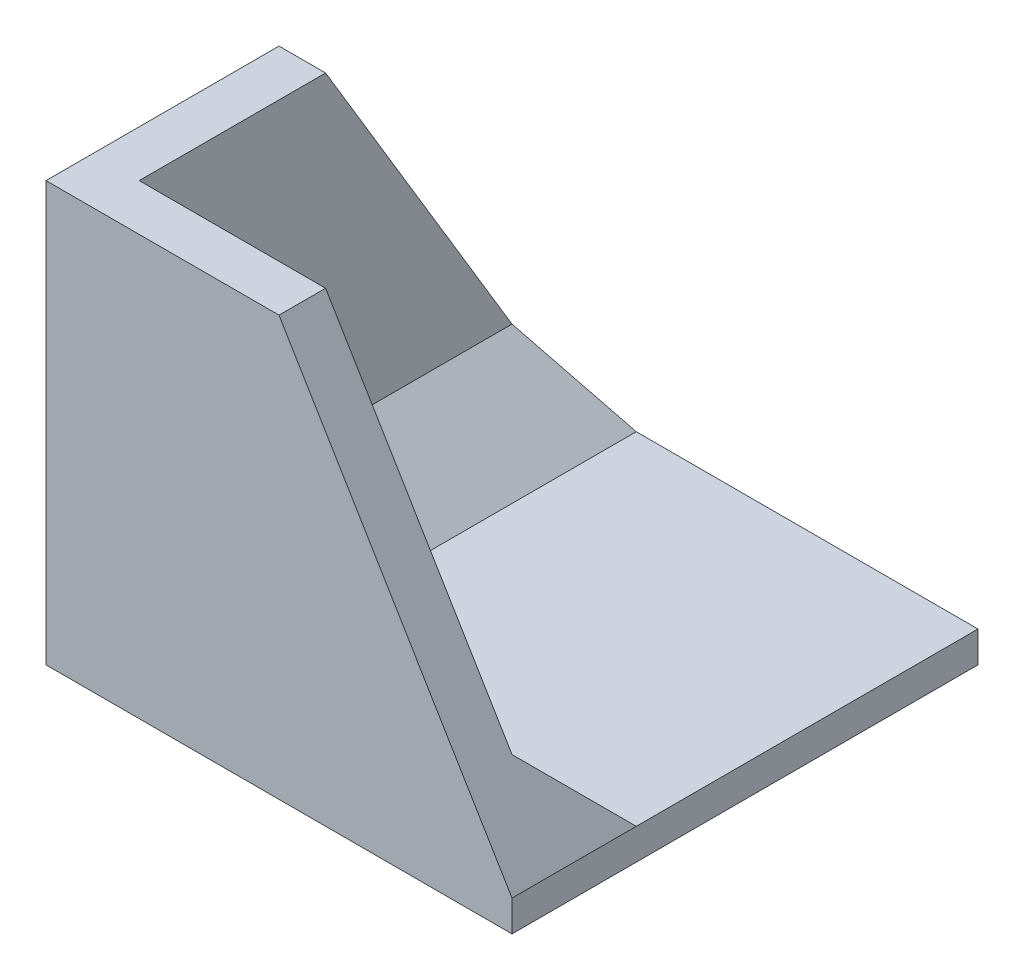
ISO-10303-21;
HEADER;
FILE_DESCRIPTION(('STEP AP214'),'2;1');
FILE_NAME('part.step','',(''),(''),'','','');
FILE_SCHEMA(('AUTOMOTIVE_DESIGN { 1 0 10303 214 1 1 1 1 }'));
ENDSEC;
DATA;
#1=APPLICATION_CONTEXT('core data for automotive mechanical design processes');
#2=APPLICATION_PROTOCOL_DEFINITION('international standard','automotive_design',2000,#1);
#3=PRODUCT_CONTEXT('',#1,'mechanical');
#4=PRODUCT('Part','Part','',(#3));
#5=PRODUCT_RELATED_PRODUCT_CATEGORY('part','',(#4));
#6=PRODUCT_DEFINITION_FORMATION('','',#4);
#7=PRODUCT_DEFINITION_CONTEXT('part definition',#1,'design');
#8=PRODUCT_DEFINITION('design','',#6,#7);
#9=PRODUCT_DEFINITION_SHAPE('','',#8);
#10=(LENGTH_UNIT() NAMED_UNIT(*) SI_UNIT(.MILLI.,.METRE.));
#11=(NAMED_UNIT(*) PLANE_ANGLE_UNIT() SI_UNIT($,.RADIAN.));
#12=(NAMED_UNIT(*) SI_UNIT($,.STERADIAN.) SOLID_ANGLE_UNIT());
#13=UNCERTAINTY_MEASURE_WITH_UNIT(LENGTH_MEASURE(1.E-05),#10,'distance_accuracy_value','');
#14=(GEOMETRIC_REPRESENTATION_CONTEXT(3) GLOBAL_UNCERTAINTY_ASSIGNED_CONTEXT((#13)) GLOBAL_UNIT_ASSIGNED_CONTEXT((#10,
#11,#12)) REPRESENTATION_CONTEXT('',''));
#15=CARTESIAN_POINT('',(0.,0.,0.));
#16=DIRECTION('',(0.,0.,1.));
#17=DIRECTION('',(1.,0.,0.));
#18=AXIS2_PLACEMENT_3D('',#15,#16,#17);
#19=CARTESIAN_POINT('',(0.,2.54,0.));
#20=DIRECTION('',(0.,-1.,0.));
#21=DIRECTION('',(0.,0.,-1.));
#22=AXIS2_PLACEMENT_3D('',#19,#20,#21);
#23=PLANE('',#22);
#24=DIRECTION('',(-1.,0.,0.));
#25=VECTOR('',#24,1.);
#26=CARTESIAN_POINT('',(-19.05,2.54,-19.05));
#27=LINE('',#26,#25);
#28=CARTESIAN_POINT('',(19.05,2.54,-19.05));
#29=VERTEX_POINT('',#28);
#30=CARTESIAN_POINT('',(-8.88999999999995,2.54,-19.05));
#31=VERTEX_POINT('',#30);
#32=EDGE_CURVE('E169',#29,#31,#27,.T.);
#33=ORIENTED_EDGE('',*,*,#32,.T.);
#34=DIRECTION('',(0.,0.,1.));
#35=VECTOR('',#34,1.);
#36=CARTESIAN_POINT('',(-8.88999999999995,2.54,15.24));
#37=LINE('',#36,#35);
#38=CARTESIAN_POINT('',(-8.88999999999995,2.54,8.88999999999995));
#39=VERTEX_POINT('',#38);
#40=EDGE_CURVE('E205',#31,#39,#37,.T.);
#41=ORIENTED_EDGE('',*,*,#40,.T.);
#42=DIRECTION('',(1.,0.,0.));
#43=VECTOR('',#42,1.);
#44=CARTESIAN_POINT('',(19.05,2.54,8.88999999999995));
#45=LINE('',#44,#43);
#46=CARTESIAN_POINT('',(19.05,2.54,8.88999999999995));
#47=VERTEX_POINT('',#46);
#48=EDGE_CURVE('E201',#39,#47,#45,.T.);
#49=ORIENTED_EDGE('',*,*,#48,.T.);
#50=DIRECTION('',(0.,0.,-1.));
#51=VECTOR('',#50,1.);
#52=CARTESIAN_POINT('',(19.05,2.54,19.05));
#53=LINE('',#52,#51);
#54=EDGE_CURVE('E170',#47,#29,#53,.T.);
#55=ORIENTED_EDGE('',*,*,#54,.T.);
#56=EDGE_LOOP('',(#33,#41,#49,#55));
#57=FACE_BOUND('',#56,.T.);
#58=ADVANCED_FACE('F39',(#57),#23,.F.);
#59=CARTESIAN_POINT('',(19.05,2.54,19.05));
#60=DIRECTION('',(-1.,0.,0.));
#61=DIRECTION('',(0.,0.,1.));
#62=AXIS2_PLACEMENT_3D('',#59,#60,#61);
#63=PLANE('',#62);
#64=DIRECTION('',(0.,0.,-1.));
#65=VECTOR('',#64,1.);
#66=CARTESIAN_POINT('',(19.05,0.,19.05));
#67=LINE('',#66,#65);
#68=CARTESIAN_POINT('',(19.05,0.,19.05));
#69=VERTEX_POINT('',#68);
#70=CARTESIAN_POINT('',(19.05,0.,-19.05));
#71=VERTEX_POINT('',#70);
#72=EDGE_CURVE('E164',#69,#71,#67,.T.);
#73=ORIENTED_EDGE('',*,*,#72,.T.);
#74=DIRECTION('',(0.,-1.,0.));
#75=VECTOR('',#74,1.);
#76=CARTESIAN_POINT('',(19.05,2.54,-19.05));
#77=LINE('',#76,#75);
#78=EDGE_CURVE('E197',#29,#71,#77,.T.);
#79=ORIENTED_EDGE('',*,*,#78,.F.);
#80=ORIENTED_EDGE('',*,*,#54,.F.);
#81=CARTESIAN_POINT('',(19.05,2.54,19.05));
#82=VERTEX_POINT('',#81);
#83=EDGE_CURVE('E165',#82,#47,#53,.T.);
#84=ORIENTED_EDGE('',*,*,#83,.F.);
#85=DIRECTION('',(0.,-1.,0.));
#86=VECTOR('',#85,1.);
#87=CARTESIAN_POINT('',(19.05,2.54,19.05));
#88=LINE('',#87,#86);
#89=EDGE_CURVE('E173',#82,#69,#88,.T.);
#90=ORIENTED_EDGE('',*,*,#89,.T.);
#91=EDGE_LOOP('',(#73,#79,#80,#84,#90));
#92=FACE_BOUND('',#91,.T.);
#93=ADVANCED_FACE('F225',(#92),#63,.F.);
#94=CARTESIAN_POINT('',(-19.05,2.54,-19.05));
#95=DIRECTION('',(0.,0.,1.));
#96=DIRECTION('',(1.,0.,0.));
#97=AXIS2_PLACEMENT_3D('',#94,#95,#96);
#98=PLANE('',#97);
#99=DIRECTION('',(-1.,0.,0.));
#100=VECTOR('',#99,1.);
#101=CARTESIAN_POINT('',(-19.05,0.,-19.05));
#102=LINE('',#101,#100);
#103=CARTESIAN_POINT('',(-19.05,0.,-19.05));
#104=VERTEX_POINT('',#103);
#105=EDGE_CURVE('E177',#71,#104,#102,.T.);
#106=ORIENTED_EDGE('',*,*,#105,.T.);
#107=DIRECTION('',(0.,-1.,0.));
#108=VECTOR('',#107,1.);
#109=CARTESIAN_POINT('',(-19.05,2.54,-19.05));
#110=LINE('',#109,#108);
#111=CARTESIAN_POINT('',(-19.05,2.54,-19.05));
#112=VERTEX_POINT('',#111);
#113=EDGE_CURVE('E193',#112,#104,#110,.T.);
#114=ORIENTED_EDGE('',*,*,#113,.F.);
#115=DIRECTION('',(-1.,0.,0.));
#116=VECTOR('',#115,1.);
#117=CARTESIAN_POINT('',(-15.24,2.54,-19.05));
#118=LINE('',#117,#116);
#119=EDGE_CURVE('E57',#31,#112,#118,.T.);
#120=ORIENTED_EDGE('',*,*,#119,.F.);
#121=ORIENTED_EDGE('',*,*,#32,.F.);
#122=ORIENTED_EDGE('',*,*,#78,.T.);
#123=EDGE_LOOP('',(#106,#114,#120,#121,#122));
#124=FACE_BOUND('',#123,.T.);
#125=ADVANCED_FACE('F223',(#124),#98,.F.);
#126=CARTESIAN_POINT('',(-19.05,2.54,19.05));
#127=DIRECTION('',(1.,0.,0.));
#128=DIRECTION('',(0.,0.,-1.));
#129=AXIS2_PLACEMENT_3D('',#126,#127,#128);
#130=PLANE('',#129);
#131=DIRECTION('',(0.,0.,1.));
#132=VECTOR('',#131,1.);
#133=CARTESIAN_POINT('',(-19.05,0.,19.05));
#134=LINE('',#133,#132);
#135=CARTESIAN_POINT('',(-19.05,0.,19.05));
#136=VERTEX_POINT('',#135);
#137=EDGE_CURVE('E180',#104,#136,#134,.T.);
#138=ORIENTED_EDGE('',*,*,#137,.T.);
#139=DIRECTION('',(0.,-1.,0.));
#140=VECTOR('',#139,1.);
#141=CARTESIAN_POINT('',(-19.05,2.54,19.05));
#142=LINE('',#141,#140);
#143=CARTESIAN_POINT('',(-19.05,34.29,19.05));
#144=VERTEX_POINT('',#143);
#145=EDGE_CURVE('E189',#144,#136,#142,.T.);
#146=ORIENTED_EDGE('',*,*,#145,.F.);
#147=DIRECTION('',(0.,0.,1.));
#148=VECTOR('',#147,1.);
#149=CARTESIAN_POINT('',(-19.05,34.29,0.));
#150=LINE('',#149,#148);
#151=CARTESIAN_POINT('',(-19.05,34.29,0.));
#152=VERTEX_POINT('',#151);
#153=EDGE_CURVE('E157',#152,#144,#150,.T.);
#154=ORIENTED_EDGE('',*,*,#153,.F.);
#155=DIRECTION('',(0.,-0.857492925712544,-0.514495755427527));
#156=VECTOR('',#155,1.);
#157=CARTESIAN_POINT('',(-19.05,2.54,-19.05));
#158=LINE('',#157,#156);
#159=EDGE_CURVE('E132',#152,#112,#158,.T.);
#160=ORIENTED_EDGE('',*,*,#159,.T.);
#161=ORIENTED_EDGE('',*,*,#113,.T.);
#162=EDGE_LOOP('',(#138,#146,#154,#160,#161));
#163=FACE_BOUND('',#162,.T.);
#164=ADVANCED_FACE('F235',(#163),#130,.F.);
#165=CARTESIAN_POINT('',(-19.05,2.54,19.05));
#166=DIRECTION('',(0.,0.,-1.));
#167=DIRECTION('',(-1.,0.,0.));
#168=AXIS2_PLACEMENT_3D('',#165,#166,#167);
#169=PLANE('',#168);
#170=ORIENTED_EDGE('',*,*,#89,.F.);
#171=DIRECTION('',(-0.514495755427526,0.857492925712544,0.));
#172=VECTOR('',#171,1.);
#173=CARTESIAN_POINT('',(0.,34.29,19.05));
#174=LINE('',#173,#172);
#175=CARTESIAN_POINT('',(0.,34.29,19.05));
#176=VERTEX_POINT('',#175);
#177=EDGE_CURVE('E134',#82,#176,#174,.T.);
#178=ORIENTED_EDGE('',*,*,#177,.T.);
#179=DIRECTION('',(1.,0.,0.));
#180=VECTOR('',#179,1.);
#181=CARTESIAN_POINT('',(0.,34.29,19.05));
#182=LINE('',#181,#180);
#183=EDGE_CURVE('E160',#144,#176,#182,.T.);
#184=ORIENTED_EDGE('',*,*,#183,.F.);
#185=ORIENTED_EDGE('',*,*,#145,.T.);
#186=DIRECTION('',(1.,0.,0.));
#187=VECTOR('',#186,1.);
#188=CARTESIAN_POINT('',(-19.05,0.,19.05));
#189=LINE('',#188,#187);
#190=EDGE_CURVE('E183',#136,#69,#189,.T.);
#191=ORIENTED_EDGE('',*,*,#190,.T.);
#192=EDGE_LOOP('',(#170,#178,#184,#185,#191));
#193=FACE_BOUND('',#192,.T.);
#194=ADVANCED_FACE('F238',(#193),#169,.F.);
#195=CARTESIAN_POINT('',(0.,0.,0.));
#196=DIRECTION('',(0.,-1.,0.));
#197=DIRECTION('',(0.,0.,-1.));
#198=AXIS2_PLACEMENT_3D('',#195,#196,#197);
#199=PLANE('',#198);
#200=ORIENTED_EDGE('',*,*,#72,.F.);
#201=ORIENTED_EDGE('',*,*,#190,.F.);
#202=ORIENTED_EDGE('',*,*,#137,.F.);
#203=ORIENTED_EDGE('',*,*,#105,.F.);
#204=EDGE_LOOP('',(#200,#201,#202,#203));
#205=FACE_BOUND('',#204,.T.);
#206=ADVANCED_FACE('F232',(#205),#199,.T.);
#207=CARTESIAN_POINT('',(0.,34.29,0.));
#208=DIRECTION('',(0.,-1.,0.));
#209=DIRECTION('',(0.,0.,-1.));
#210=AXIS2_PLACEMENT_3D('',#207,#208,#209);
#211=PLANE('',#210);
#212=DIRECTION('',(0.,0.,-1.));
#213=VECTOR('',#212,1.);
#214=CARTESIAN_POINT('',(0.,34.29,0.));
#215=LINE('',#214,#213);
#216=CARTESIAN_POINT('',(0.,34.29,15.24));
#217=VERTEX_POINT('',#216);
#218=EDGE_CURVE('E151',#176,#217,#215,.T.);
#219=ORIENTED_EDGE('',*,*,#218,.T.);
#220=DIRECTION('',(1.,0.,0.));
#221=VECTOR('',#220,1.);
#222=CARTESIAN_POINT('',(-15.24,34.29,15.24));
#223=LINE('',#222,#221);
#224=CARTESIAN_POINT('',(-15.24,34.29,15.24));
#225=VERTEX_POINT('',#224);
#226=EDGE_CURVE('E119',#225,#217,#223,.T.);
#227=ORIENTED_EDGE('',*,*,#226,.F.);
#228=DIRECTION('',(0.,0.,1.));
#229=VECTOR('',#228,1.);
#230=CARTESIAN_POINT('',(-15.24,34.29,0.));
#231=LINE('',#230,#229);
#232=CARTESIAN_POINT('',(-15.24,34.29,0.));
#233=VERTEX_POINT('',#232);
#234=EDGE_CURVE('E111',#233,#225,#231,.T.);
#235=ORIENTED_EDGE('',*,*,#234,.F.);
#236=DIRECTION('',(-1.,0.,0.));
#237=VECTOR('',#236,1.);
#238=CARTESIAN_POINT('',(-15.24,34.29,0.));
#239=LINE('',#238,#237);
#240=EDGE_CURVE('E116',#233,#152,#239,.T.);
#241=ORIENTED_EDGE('',*,*,#240,.T.);
#242=ORIENTED_EDGE('',*,*,#153,.T.);
#243=ORIENTED_EDGE('',*,*,#183,.T.);
#244=EDGE_LOOP('',(#219,#227,#235,#241,#242,#243));
#245=FACE_BOUND('',#244,.T.);
#246=ADVANCED_FACE('F114',(#245),#211,.F.);
#247=CARTESIAN_POINT('',(0.,34.29,15.24));
#248=DIRECTION('',(0.857492925712544,0.514495755427526,0.));
#249=DIRECTION('',(-0.514495755427527,0.857492925712544,0.));
#250=AXIS2_PLACEMENT_3D('',#247,#248,#249);
#251=PLANE('',#250);
#252=ORIENTED_EDGE('',*,*,#177,.F.);
#253=ORIENTED_EDGE('',*,*,#83,.T.);
#254=DIRECTION('',(0.39056673294247,-0.650944554904116,-0.650944554904123));
#255=VECTOR('',#254,1.);
#256=CARTESIAN_POINT('',(16.1440677966102,7.38322033898301,13.733220338983));
#257=LINE('',#256,#255);
#258=CARTESIAN_POINT('',(15.24,8.88999999999998,15.24));
#259=VERTEX_POINT('',#258);
#260=EDGE_CURVE('E11',#47,#259,#257,.F.);
#261=ORIENTED_EDGE('',*,*,#260,.T.);
#262=DIRECTION('',(-0.514495755427526,0.857492925712544,0.));
#263=VECTOR('',#262,1.);
#264=CARTESIAN_POINT('',(0.,34.29,15.24));
#265=LINE('',#264,#263);
#266=EDGE_CURVE('E148',#259,#217,#265,.T.);
#267=ORIENTED_EDGE('',*,*,#266,.T.);
#268=ORIENTED_EDGE('',*,*,#218,.F.);
#269=EDGE_LOOP('',(#252,#253,#261,#267,#268));
#270=FACE_BOUND('',#269,.T.);
#271=ADVANCED_FACE('F240',(#270),#251,.T.);
#272=CARTESIAN_POINT('',(0.,0.,15.24));
#273=DIRECTION('',(0.,0.,1.));
#274=DIRECTION('',(1.,0.,0.));
#275=AXIS2_PLACEMENT_3D('',#272,#273,#274);
#276=PLANE('',#275);
#277=ORIENTED_EDGE('',*,*,#266,.F.);
#278=DIRECTION('',(-1.,0.,0.));
#279=VECTOR('',#278,1.);
#280=CARTESIAN_POINT('',(-15.24,8.88999999999998,15.24));
#281=LINE('',#280,#279);
#282=CARTESIAN_POINT('',(-15.24,8.88999999999998,15.24));
#283=VERTEX_POINT('',#282);
#284=EDGE_CURVE('E211',#259,#283,#281,.T.);
#285=ORIENTED_EDGE('',*,*,#284,.T.);
#286=DIRECTION('',(0.,1.,0.));
#287=VECTOR('',#286,1.);
#288=CARTESIAN_POINT('',(-15.24,-19.012614690566,15.24));
#289=LINE('',#288,#287);
#290=EDGE_CURVE('E144',#283,#225,#289,.T.);
#291=ORIENTED_EDGE('',*,*,#290,.T.);
#292=ORIENTED_EDGE('',*,*,#226,.T.);
#293=EDGE_LOOP('',(#277,#285,#291,#292));
#294=FACE_BOUND('',#293,.T.);
#295=ADVANCED_FACE('F244',(#294),#276,.F.);
#296=CARTESIAN_POINT('',(-15.24,2.54,-19.05));
#297=DIRECTION('',(0.,0.514495755427527,-0.857492925712544));
#298=DIRECTION('',(0.,0.857492925712544,0.514495755427527));
#299=AXIS2_PLACEMENT_3D('',#296,#297,#298);
#300=PLANE('',#299);
#301=ORIENTED_EDGE('',*,*,#159,.F.);
#302=ORIENTED_EDGE('',*,*,#240,.F.);
#303=DIRECTION('',(0.,-0.857492925712544,-0.514495755427527));
#304=VECTOR('',#303,1.);
#305=CARTESIAN_POINT('',(-15.24,2.54,-19.05));
#306=LINE('',#305,#304);
#307=CARTESIAN_POINT('',(-15.24,8.88999999999998,-15.24));
#308=VERTEX_POINT('',#307);
#309=EDGE_CURVE('E129',#233,#308,#306,.T.);
#310=ORIENTED_EDGE('',*,*,#309,.T.);
#311=DIRECTION('',(-0.650944554904123,0.650944554904116,0.39056673294247));
#312=VECTOR('',#311,1.);
#313=CARTESIAN_POINT('',(-13.733220338983,7.38322033898301,-16.1440677966102));
#314=LINE('',#313,#312);
#315=EDGE_CURVE('E50',#308,#31,#314,.F.);
#316=ORIENTED_EDGE('',*,*,#315,.T.);
#317=ORIENTED_EDGE('',*,*,#119,.T.);
#318=EDGE_LOOP('',(#301,#302,#310,#316,#317));
#319=FACE_BOUND('',#318,.T.);
#320=ADVANCED_FACE('F127',(#319),#300,.T.);
#321=CARTESIAN_POINT('',(-15.24,0.,0.));
#322=DIRECTION('',(-1.,0.,0.));
#323=DIRECTION('',(0.,0.,1.));
#324=AXIS2_PLACEMENT_3D('',#321,#322,#323);
#325=PLANE('',#324);
#326=ORIENTED_EDGE('',*,*,#290,.F.);
#327=DIRECTION('',(0.,0.,-1.));
#328=VECTOR('',#327,1.);
#329=CARTESIAN_POINT('',(-15.24,8.88999999999998,-19.05));
#330=LINE('',#329,#328);
#331=EDGE_CURVE('E138',#283,#308,#330,.T.);
#332=ORIENTED_EDGE('',*,*,#331,.T.);
#333=ORIENTED_EDGE('',*,*,#309,.F.);
#334=ORIENTED_EDGE('',*,*,#234,.T.);
#335=EDGE_LOOP('',(#326,#332,#333,#334));
#336=FACE_BOUND('',#335,.T.);
#337=ADVANCED_FACE('F136',(#336),#325,.F.);
#338=CARTESIAN_POINT('',(0.,2.54,8.88999999999995));
#339=DIRECTION('',(0.,0.707106781186551,-0.707106781186544));
#340=DIRECTION('',(-1.,0.,0.));
#341=AXIS2_PLACEMENT_3D('',#338,#339,#340);
#342=PLANE('',#341);
#343=ORIENTED_EDGE('',*,*,#260,.F.);
#344=ORIENTED_EDGE('',*,*,#48,.F.);
#345=DIRECTION('',(-0.577350269189628,0.577350269189622,0.577350269189628));
#346=VECTOR('',#345,1.);
#347=CARTESIAN_POINT('',(-5.92666666666661,-0.423333333333307,5.92666666666661));
#348=LINE('',#347,#346);
#349=EDGE_CURVE('E43',#283,#39,#348,.F.);
#350=ORIENTED_EDGE('',*,*,#349,.F.);
#351=ORIENTED_EDGE('',*,*,#284,.F.);
#352=EDGE_LOOP('',(#343,#344,#350,#351));
#353=FACE_BOUND('',#352,.T.);
#354=ADVANCED_FACE('F41',(#353),#342,.T.);
#355=CARTESIAN_POINT('',(-8.88999999999995,2.54,0.));
#356=DIRECTION('',(0.707106781186544,0.707106781186551,0.));
#357=DIRECTION('',(0.,0.,-1.));
#358=AXIS2_PLACEMENT_3D('',#355,#356,#357);
#359=PLANE('',#358);
#360=ORIENTED_EDGE('',*,*,#315,.F.);
#361=ORIENTED_EDGE('',*,*,#331,.F.);
#362=ORIENTED_EDGE('',*,*,#349,.T.);
#363=ORIENTED_EDGE('',*,*,#40,.F.);
#364=EDGE_LOOP('',(#360,#361,#362,#363));
#365=FACE_BOUND('',#364,.T.);
#366=ADVANCED_FACE('F217',(#365),#359,.T.);
#367=CLOSED_SHELL('',(#58,#93,#125,#164,#194,#206,#246,#271,#295,#320,#337,#354,#366));
#368=MANIFOLD_SOLID_BREP('B2',#367);
#369=ADVANCED_BREP_SHAPE_REPRESENTATION('',(#18,#368),#14);
#370=SHAPE_DEFINITION_REPRESENTATION(#9,#369);
ENDSEC;
END-ISO-10303-21;
